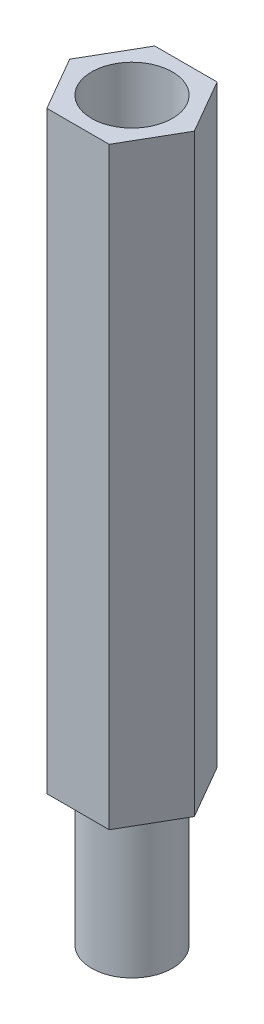
ISO-10303-21;
HEADER;
FILE_DESCRIPTION(('STEP AP214'),'2;1');
FILE_NAME('part.step','',(''),(''),'','','');
FILE_SCHEMA(('AUTOMOTIVE_DESIGN { 1 0 10303 214 1 1 1 1 }'));
ENDSEC;
DATA;
#1=APPLICATION_CONTEXT('core data for automotive mechanical design processes');
#2=APPLICATION_PROTOCOL_DEFINITION('international standard','automotive_design',2000,#1);
#3=PRODUCT_CONTEXT('',#1,'mechanical');
#4=PRODUCT('Part','Part','',(#3));
#5=PRODUCT_RELATED_PRODUCT_CATEGORY('part','',(#4));
#6=PRODUCT_DEFINITION_FORMATION('','',#4);
#7=PRODUCT_DEFINITION_CONTEXT('part definition',#1,'design');
#8=PRODUCT_DEFINITION('design','',#6,#7);
#9=PRODUCT_DEFINITION_SHAPE('','',#8);
#10=(LENGTH_UNIT() NAMED_UNIT(*) SI_UNIT(.MILLI.,.METRE.));
#11=(NAMED_UNIT(*) PLANE_ANGLE_UNIT() SI_UNIT($,.RADIAN.));
#12=(NAMED_UNIT(*) SI_UNIT($,.STERADIAN.) SOLID_ANGLE_UNIT());
#13=UNCERTAINTY_MEASURE_WITH_UNIT(LENGTH_MEASURE(1.E-05),#10,'distance_accuracy_value','');
#14=(GEOMETRIC_REPRESENTATION_CONTEXT(3) GLOBAL_UNCERTAINTY_ASSIGNED_CONTEXT((#13)) GLOBAL_UNIT_ASSIGNED_CONTEXT((#10,
#11,#12)) REPRESENTATION_CONTEXT('',''));
#15=CARTESIAN_POINT('',(0.,0.,0.));
#16=DIRECTION('',(0.,0.,1.));
#17=DIRECTION('',(1.,0.,0.));
#18=AXIS2_PLACEMENT_3D('',#15,#16,#17);
#19=CARTESIAN_POINT('',(1.31249999999999,25.,-2.27331668493415));
#20=DIRECTION('',(-0.866025403784438,0.,0.500000000000001));
#21=DIRECTION('',(0.500000000000001,0.,0.866025403784438));
#22=AXIS2_PLACEMENT_3D('',#19,#20,#21);
#23=PLANE('',#22);
#24=DIRECTION('',(-0.500000000000001,0.,-0.866025403784438));
#25=VECTOR('',#24,1.);
#26=CARTESIAN_POINT('',(1.31249999999999,0.,-2.27331668493415));
#27=LINE('',#26,#25);
#28=CARTESIAN_POINT('',(2.625,0.,0.));
#29=VERTEX_POINT('',#28);
#30=CARTESIAN_POINT('',(1.31249999999999,0.,-2.27331668493415));
#31=VERTEX_POINT('',#30);
#32=EDGE_CURVE('E128',#29,#31,#27,.T.);
#33=ORIENTED_EDGE('',*,*,#32,.T.);
#34=DIRECTION('',(0.,-1.,0.));
#35=VECTOR('',#34,1.);
#36=CARTESIAN_POINT('',(1.31249999999999,25.,-2.27331668493415));
#37=LINE('',#36,#35);
#38=CARTESIAN_POINT('',(1.31249999999999,25.,-2.27331668493415));
#39=VERTEX_POINT('',#38);
#40=EDGE_CURVE('E11',#39,#31,#37,.T.);
#41=ORIENTED_EDGE('',*,*,#40,.F.);
#42=DIRECTION('',(-0.500000000000001,0.,-0.866025403784438));
#43=VECTOR('',#42,1.);
#44=CARTESIAN_POINT('',(1.31249999999999,25.,-2.27331668493415));
#45=LINE('',#44,#43);
#46=CARTESIAN_POINT('',(2.625,25.,0.));
#47=VERTEX_POINT('',#46);
#48=EDGE_CURVE('E145',#47,#39,#45,.T.);
#49=ORIENTED_EDGE('',*,*,#48,.F.);
#50=DIRECTION('',(0.,-1.,0.));
#51=VECTOR('',#50,1.);
#52=CARTESIAN_POINT('',(2.625,25.,0.));
#53=LINE('',#52,#51);
#54=EDGE_CURVE('E124',#47,#29,#53,.T.);
#55=ORIENTED_EDGE('',*,*,#54,.T.);
#56=EDGE_LOOP('',(#33,#41,#49,#55));
#57=FACE_BOUND('',#56,.T.);
#58=ADVANCED_FACE('F39',(#57),#23,.F.);
#59=CARTESIAN_POINT('',(1.31249999999999,25.,-2.27331668493415));
#60=DIRECTION('',(0.,0.,1.));
#61=DIRECTION('',(1.,0.,0.));
#62=AXIS2_PLACEMENT_3D('',#59,#60,#61);
#63=PLANE('',#62);
#64=DIRECTION('',(-1.,0.,0.));
#65=VECTOR('',#64,1.);
#66=CARTESIAN_POINT('',(1.31249999999999,0.,-2.27331668493415));
#67=LINE('',#66,#65);
#68=CARTESIAN_POINT('',(-1.3125,0.,-2.27331668493415));
#69=VERTEX_POINT('',#68);
#70=EDGE_CURVE('E132',#31,#69,#67,.T.);
#71=ORIENTED_EDGE('',*,*,#70,.T.);
#72=DIRECTION('',(0.,-1.,0.));
#73=VECTOR('',#72,1.);
#74=CARTESIAN_POINT('',(-1.3125,25.,-2.27331668493415));
#75=LINE('',#74,#73);
#76=CARTESIAN_POINT('',(-1.3125,25.,-2.27331668493415));
#77=VERTEX_POINT('',#76);
#78=EDGE_CURVE('E48',#77,#69,#75,.T.);
#79=ORIENTED_EDGE('',*,*,#78,.F.);
#80=DIRECTION('',(-1.,0.,0.));
#81=VECTOR('',#80,1.);
#82=CARTESIAN_POINT('',(1.31249999999999,25.,-2.27331668493415));
#83=LINE('',#82,#81);
#84=EDGE_CURVE('E93',#39,#77,#83,.T.);
#85=ORIENTED_EDGE('',*,*,#84,.F.);
#86=ORIENTED_EDGE('',*,*,#40,.T.);
#87=EDGE_LOOP('',(#71,#79,#85,#86));
#88=FACE_BOUND('',#87,.T.);
#89=ADVANCED_FACE('F174',(#88),#63,.F.);
#90=CARTESIAN_POINT('',(-1.3125,25.,-2.27331668493415));
#91=DIRECTION('',(0.866025403784439,0.,0.5));
#92=DIRECTION('',(0.5,0.,-0.866025403784439));
#93=AXIS2_PLACEMENT_3D('',#90,#91,#92);
#94=PLANE('',#93);
#95=DIRECTION('',(-0.5,0.,0.866025403784439));
#96=VECTOR('',#95,1.);
#97=CARTESIAN_POINT('',(-1.3125,0.,-2.27331668493415));
#98=LINE('',#97,#96);
#99=CARTESIAN_POINT('',(-2.625,0.,0.));
#100=VERTEX_POINT('',#99);
#101=EDGE_CURVE('E136',#69,#100,#98,.T.);
#102=ORIENTED_EDGE('',*,*,#101,.T.);
#103=DIRECTION('',(0.,-1.,0.));
#104=VECTOR('',#103,1.);
#105=CARTESIAN_POINT('',(-2.625,25.,0.));
#106=LINE('',#105,#104);
#107=CARTESIAN_POINT('',(-2.625,25.,0.));
#108=VERTEX_POINT('',#107);
#109=EDGE_CURVE('E117',#108,#100,#106,.T.);
#110=ORIENTED_EDGE('',*,*,#109,.F.);
#111=DIRECTION('',(-0.5,0.,0.866025403784439));
#112=VECTOR('',#111,1.);
#113=CARTESIAN_POINT('',(-1.3125,25.,-2.27331668493415));
#114=LINE('',#113,#112);
#115=EDGE_CURVE('E106',#77,#108,#114,.T.);
#116=ORIENTED_EDGE('',*,*,#115,.F.);
#117=ORIENTED_EDGE('',*,*,#78,.T.);
#118=EDGE_LOOP('',(#102,#110,#116,#117));
#119=FACE_BOUND('',#118,.T.);
#120=ADVANCED_FACE('F155',(#119),#94,.F.);
#121=CARTESIAN_POINT('',(-1.3125,25.,2.27331668493415));
#122=DIRECTION('',(0.866025403784439,0.,-0.5));
#123=DIRECTION('',(-0.5,0.,-0.866025403784439));
#124=AXIS2_PLACEMENT_3D('',#121,#122,#123);
#125=PLANE('',#124);
#126=DIRECTION('',(0.5,0.,0.866025403784439));
#127=VECTOR('',#126,1.);
#128=CARTESIAN_POINT('',(-1.3125,0.,2.27331668493415));
#129=LINE('',#128,#127);
#130=CARTESIAN_POINT('',(-1.3125,0.,2.27331668493415));
#131=VERTEX_POINT('',#130);
#132=EDGE_CURVE('E115',#100,#131,#129,.T.);
#133=ORIENTED_EDGE('',*,*,#132,.T.);
#134=DIRECTION('',(0.,-1.,0.));
#135=VECTOR('',#134,1.);
#136=CARTESIAN_POINT('',(-1.3125,25.,2.27331668493415));
#137=LINE('',#136,#135);
#138=CARTESIAN_POINT('',(-1.3125,25.,2.27331668493415));
#139=VERTEX_POINT('',#138);
#140=EDGE_CURVE('E112',#139,#131,#137,.T.);
#141=ORIENTED_EDGE('',*,*,#140,.F.);
#142=DIRECTION('',(0.5,0.,0.866025403784439));
#143=VECTOR('',#142,1.);
#144=CARTESIAN_POINT('',(-1.3125,25.,2.27331668493415));
#145=LINE('',#144,#143);
#146=EDGE_CURVE('E100',#108,#139,#145,.T.);
#147=ORIENTED_EDGE('',*,*,#146,.F.);
#148=ORIENTED_EDGE('',*,*,#109,.T.);
#149=EDGE_LOOP('',(#133,#141,#147,#148));
#150=FACE_BOUND('',#149,.T.);
#151=ADVANCED_FACE('F113',(#150),#125,.F.);
#152=CARTESIAN_POINT('',(1.31249999999999,25.,2.27331668493415));
#153=DIRECTION('',(0.,0.,-1.));
#154=DIRECTION('',(-1.,0.,0.));
#155=AXIS2_PLACEMENT_3D('',#152,#153,#154);
#156=PLANE('',#155);
#157=DIRECTION('',(1.,0.,0.));
#158=VECTOR('',#157,1.);
#159=CARTESIAN_POINT('',(1.31249999999999,0.,2.27331668493415));
#160=LINE('',#159,#158);
#161=CARTESIAN_POINT('',(1.31249999999999,0.,2.27331668493415));
#162=VERTEX_POINT('',#161);
#163=EDGE_CURVE('E79',#131,#162,#160,.T.);
#164=ORIENTED_EDGE('',*,*,#163,.T.);
#165=DIRECTION('',(0.,-1.,0.));
#166=VECTOR('',#165,1.);
#167=CARTESIAN_POINT('',(1.31249999999999,25.,2.27331668493415));
#168=LINE('',#167,#166);
#169=CARTESIAN_POINT('',(1.31249999999999,25.,2.27331668493415));
#170=VERTEX_POINT('',#169);
#171=EDGE_CURVE('E118',#170,#162,#168,.T.);
#172=ORIENTED_EDGE('',*,*,#171,.F.);
#173=DIRECTION('',(1.,0.,0.));
#174=VECTOR('',#173,1.);
#175=CARTESIAN_POINT('',(1.31249999999999,25.,2.27331668493415));
#176=LINE('',#175,#174);
#177=EDGE_CURVE('E104',#139,#170,#176,.T.);
#178=ORIENTED_EDGE('',*,*,#177,.F.);
#179=ORIENTED_EDGE('',*,*,#140,.T.);
#180=EDGE_LOOP('',(#164,#172,#178,#179));
#181=FACE_BOUND('',#180,.T.);
#182=ADVANCED_FACE('F120',(#181),#156,.F.);
#183=CARTESIAN_POINT('',(1.31249999999999,25.,2.27331668493415));
#184=DIRECTION('',(-0.866025403784438,0.,-0.500000000000001));
#185=DIRECTION('',(-0.500000000000001,0.,0.866025403784438));
#186=AXIS2_PLACEMENT_3D('',#183,#184,#185);
#187=PLANE('',#186);
#188=DIRECTION('',(0.500000000000001,0.,-0.866025403784438));
#189=VECTOR('',#188,1.);
#190=CARTESIAN_POINT('',(1.31249999999999,0.,2.27331668493415));
#191=LINE('',#190,#189);
#192=EDGE_CURVE('E85',#162,#29,#191,.T.);
#193=ORIENTED_EDGE('',*,*,#192,.T.);
#194=ORIENTED_EDGE('',*,*,#54,.F.);
#195=DIRECTION('',(0.500000000000001,0.,-0.866025403784438));
#196=VECTOR('',#195,1.);
#197=CARTESIAN_POINT('',(1.31249999999999,25.,2.27331668493415));
#198=LINE('',#197,#196);
#199=EDGE_CURVE('E56',#170,#47,#198,.T.);
#200=ORIENTED_EDGE('',*,*,#199,.F.);
#201=ORIENTED_EDGE('',*,*,#171,.T.);
#202=EDGE_LOOP('',(#193,#194,#200,#201));
#203=FACE_BOUND('',#202,.T.);
#204=ADVANCED_FACE('F162',(#203),#187,.F.);
#205=CARTESIAN_POINT('',(0.,25.,0.));
#206=DIRECTION('',(0.,1.,0.));
#207=DIRECTION('',(0.,0.,1.));
#208=AXIS2_PLACEMENT_3D('',#205,#206,#207);
#209=PLANE('',#208);
#210=CARTESIAN_POINT('',(0.,25.,0.));
#211=DIRECTION('',(0.,1.,0.));
#212=DIRECTION('',(0.,0.,1.));
#213=AXIS2_PLACEMENT_3D('',#210,#211,#212);
#214=CIRCLE('',#213,1.7);
#215=CARTESIAN_POINT('',(0.,25.,1.7));
#216=VERTEX_POINT('',#215);
#217=EDGE_CURVE('E259',#216,#216,#214,.T.);
#218=ORIENTED_EDGE('',*,*,#217,.F.);
#219=EDGE_LOOP('',(#218));
#220=FACE_BOUND('',#219,.T.);
#221=ORIENTED_EDGE('',*,*,#48,.T.);
#222=ORIENTED_EDGE('',*,*,#84,.T.);
#223=ORIENTED_EDGE('',*,*,#115,.T.);
#224=ORIENTED_EDGE('',*,*,#146,.T.);
#225=ORIENTED_EDGE('',*,*,#177,.T.);
#226=ORIENTED_EDGE('',*,*,#199,.T.);
#227=EDGE_LOOP('',(#221,#222,#223,#224,#225,#226));
#228=FACE_BOUND('',#227,.T.);
#229=ADVANCED_FACE('F102',(#220,#228),#209,.T.);
#230=CARTESIAN_POINT('',(0.,0.,0.));
#231=DIRECTION('',(0.,1.,0.));
#232=DIRECTION('',(0.,0.,1.));
#233=AXIS2_PLACEMENT_3D('',#230,#231,#232);
#234=PLANE('',#233);
#235=CARTESIAN_POINT('',(0.,0.,0.));
#236=DIRECTION('',(0.,1.,0.));
#237=DIRECTION('',(0.,0.,1.));
#238=AXIS2_PLACEMENT_3D('',#235,#236,#237);
#239=CIRCLE('',#238,1.7);
#240=CARTESIAN_POINT('',(0.,0.,1.7));
#241=VERTEX_POINT('',#240);
#242=EDGE_CURVE('E258',#241,#241,#239,.T.);
#243=ORIENTED_EDGE('',*,*,#242,.T.);
#244=EDGE_LOOP('',(#243));
#245=FACE_BOUND('',#244,.T.);
#246=ORIENTED_EDGE('',*,*,#32,.F.);
#247=ORIENTED_EDGE('',*,*,#192,.F.);
#248=ORIENTED_EDGE('',*,*,#163,.F.);
#249=ORIENTED_EDGE('',*,*,#132,.F.);
#250=ORIENTED_EDGE('',*,*,#101,.F.);
#251=ORIENTED_EDGE('',*,*,#70,.F.);
#252=EDGE_LOOP('',(#246,#247,#248,#249,#250,#251));
#253=FACE_BOUND('',#252,.T.);
#254=ADVANCED_FACE('F158',(#245,#253),#234,.F.);
#255=CARTESIAN_POINT('',(0.,-6.,0.));
#256=DIRECTION('',(0.,1.,0.));
#257=DIRECTION('',(0.,0.,1.));
#258=AXIS2_PLACEMENT_3D('',#255,#256,#257);
#259=CYLINDRICAL_SURFACE('',#258,1.7);
#260=CARTESIAN_POINT('',(0.,-6.,0.));
#261=DIRECTION('',(0.,1.,0.));
#262=DIRECTION('',(0.,0.,1.));
#263=AXIS2_PLACEMENT_3D('',#260,#261,#262);
#264=CIRCLE('',#263,1.7);
#265=CARTESIAN_POINT('',(0.,-6.,1.7));
#266=VERTEX_POINT('',#265);
#267=EDGE_CURVE('E133',#266,#266,#264,.T.);
#268=ORIENTED_EDGE('',*,*,#267,.T.);
#269=EDGE_LOOP('',(#268));
#270=FACE_BOUND('',#269,.T.);
#271=ORIENTED_EDGE('',*,*,#242,.F.);
#272=EDGE_LOOP('',(#271));
#273=FACE_BOUND('',#272,.T.);
#274=ADVANCED_FACE('F206',(#270,#273),#259,.T.);
#275=CARTESIAN_POINT('',(0.,-6.,0.));
#276=DIRECTION('',(0.,1.,0.));
#277=DIRECTION('',(0.,0.,1.));
#278=AXIS2_PLACEMENT_3D('',#275,#276,#277);
#279=PLANE('',#278);
#280=ORIENTED_EDGE('',*,*,#267,.F.);
#281=EDGE_LOOP('',(#280));
#282=FACE_BOUND('',#281,.T.);
#283=ADVANCED_FACE('F215',(#282),#279,.F.);
#284=CARTESIAN_POINT('',(0.,21.,0.));
#285=DIRECTION('',(0.,1.,0.));
#286=DIRECTION('',(0.,0.,1.));
#287=AXIS2_PLACEMENT_3D('',#284,#285,#286);
#288=CYLINDRICAL_SURFACE('',#287,1.7);
#289=CARTESIAN_POINT('',(0.,21.,0.));
#290=DIRECTION('',(0.,1.,0.));
#291=DIRECTION('',(0.,0.,1.));
#292=AXIS2_PLACEMENT_3D('',#289,#290,#291);
#293=CIRCLE('',#292,1.7);
#294=CARTESIAN_POINT('',(0.,21.,1.7));
#295=VERTEX_POINT('',#294);
#296=EDGE_CURVE('E256',#295,#295,#293,.T.);
#297=ORIENTED_EDGE('',*,*,#296,.F.);
#298=EDGE_LOOP('',(#297));
#299=FACE_BOUND('',#298,.T.);
#300=ORIENTED_EDGE('',*,*,#217,.T.);
#301=EDGE_LOOP('',(#300));
#302=FACE_BOUND('',#301,.T.);
#303=ADVANCED_FACE('F225',(#299,#302),#288,.F.);
#304=CARTESIAN_POINT('',(0.,21.,0.));
#305=DIRECTION('',(0.,1.,0.));
#306=DIRECTION('',(0.,0.,1.));
#307=AXIS2_PLACEMENT_3D('',#304,#305,#306);
#308=PLANE('',#307);
#309=ORIENTED_EDGE('',*,*,#296,.T.);
#310=EDGE_LOOP('',(#309));
#311=FACE_BOUND('',#310,.T.);
#312=ADVANCED_FACE('F240',(#311),#308,.T.);
#313=CLOSED_SHELL('',(#58,#89,#120,#151,#182,#204,#229,#254,#274,#283,#303,#312));
#314=MANIFOLD_SOLID_BREP('B2',#313);
#315=ADVANCED_BREP_SHAPE_REPRESENTATION('',(#18,#314),#14);
#316=SHAPE_DEFINITION_REPRESENTATION(#9,#315);
ENDSEC;
END-ISO-10303-21;
